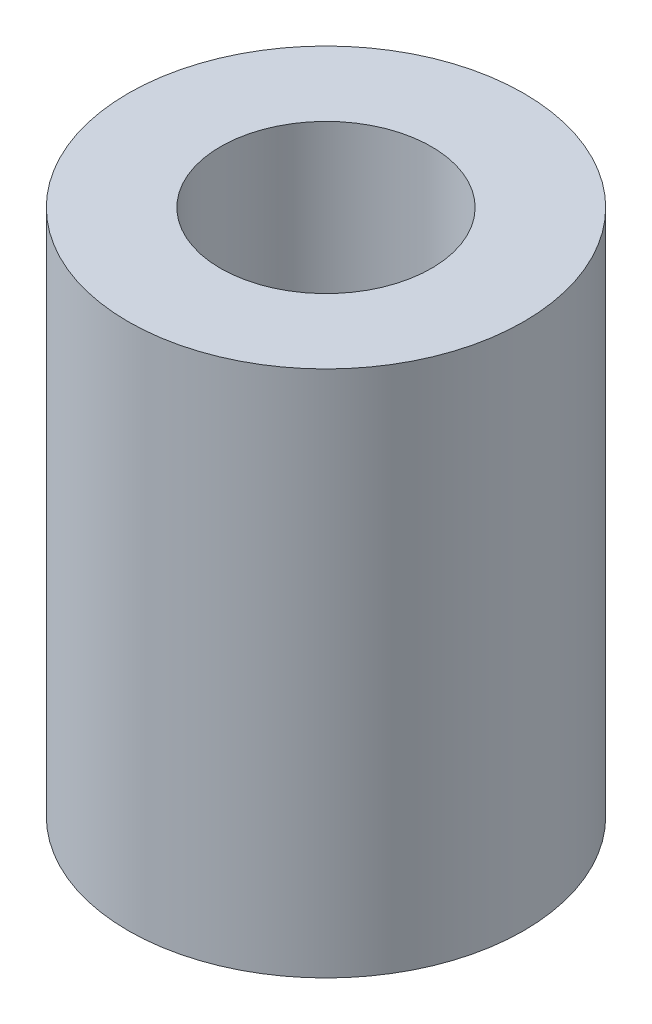
ISO-10303-21;
HEADER;
FILE_DESCRIPTION(('STEP AP214'),'2;1');
FILE_NAME('part.step','',(''),(''),'','','');
FILE_SCHEMA(('AUTOMOTIVE_DESIGN { 1 0 10303 214 1 1 1 1 }'));
ENDSEC;
DATA;
#1=APPLICATION_CONTEXT('core data for automotive mechanical design processes');
#2=APPLICATION_PROTOCOL_DEFINITION('international standard','automotive_design',2000,#1);
#3=PRODUCT_CONTEXT('',#1,'mechanical');
#4=PRODUCT('Part','Part','',(#3));
#5=PRODUCT_RELATED_PRODUCT_CATEGORY('part','',(#4));
#6=PRODUCT_DEFINITION_FORMATION('','',#4);
#7=PRODUCT_DEFINITION_CONTEXT('part definition',#1,'design');
#8=PRODUCT_DEFINITION('design','',#6,#7);
#9=PRODUCT_DEFINITION_SHAPE('','',#8);
#10=(LENGTH_UNIT() NAMED_UNIT(*) SI_UNIT(.MILLI.,.METRE.));
#11=(NAMED_UNIT(*) PLANE_ANGLE_UNIT() SI_UNIT($,.RADIAN.));
#12=(NAMED_UNIT(*) SI_UNIT($,.STERADIAN.) SOLID_ANGLE_UNIT());
#13=UNCERTAINTY_MEASURE_WITH_UNIT(LENGTH_MEASURE(1.E-05),#10,'distance_accuracy_value','');
#14=(GEOMETRIC_REPRESENTATION_CONTEXT(3) GLOBAL_UNCERTAINTY_ASSIGNED_CONTEXT((#13)) GLOBAL_UNIT_ASSIGNED_CONTEXT((#10,
#11,#12)) REPRESENTATION_CONTEXT('',''));
#15=CARTESIAN_POINT('',(0.,0.,0.));
#16=DIRECTION('',(0.,0.,1.));
#17=DIRECTION('',(1.,0.,0.));
#18=AXIS2_PLACEMENT_3D('',#15,#16,#17);
#19=CARTESIAN_POINT('',(0.,8.,0.));
#20=DIRECTION('',(0.,1.,0.));
#21=DIRECTION('',(0.,0.,1.));
#22=AXIS2_PLACEMENT_3D('',#19,#20,#21);
#23=PLANE('',#22);
#24=CARTESIAN_POINT('',(0.,8.,0.));
#25=DIRECTION('',(0.,1.,0.));
#26=DIRECTION('',(0.,0.,1.));
#27=AXIS2_PLACEMENT_3D('',#24,#25,#26);
#28=CIRCLE('',#27,3.);
#29=CARTESIAN_POINT('',(0.,8.,3.));
#30=VERTEX_POINT('',#29);
#31=EDGE_CURVE('E10',#30,#30,#28,.T.);
#32=ORIENTED_EDGE('',*,*,#31,.T.);
#33=EDGE_LOOP('',(#32));
#34=FACE_BOUND('',#33,.T.);
#35=CARTESIAN_POINT('',(0.,8.,0.));
#36=DIRECTION('',(0.,1.,0.));
#37=DIRECTION('',(0.,0.,1.));
#38=AXIS2_PLACEMENT_3D('',#35,#36,#37);
#39=CIRCLE('',#38,1.6);
#40=CARTESIAN_POINT('',(0.,8.,1.6));
#41=VERTEX_POINT('',#40);
#42=EDGE_CURVE('E52',#41,#41,#39,.T.);
#43=ORIENTED_EDGE('',*,*,#42,.F.);
#44=EDGE_LOOP('',(#43));
#45=FACE_BOUND('',#44,.T.);
#46=ADVANCED_FACE('F38',(#34,#45),#23,.T.);
#47=CARTESIAN_POINT('',(0.,0.,0.));
#48=DIRECTION('',(0.,1.,0.));
#49=DIRECTION('',(0.,0.,1.));
#50=AXIS2_PLACEMENT_3D('',#47,#48,#49);
#51=PLANE('',#50);
#52=CARTESIAN_POINT('',(0.,0.,0.));
#53=DIRECTION('',(0.,1.,0.));
#54=DIRECTION('',(0.,0.,1.));
#55=AXIS2_PLACEMENT_3D('',#52,#53,#54);
#56=CIRCLE('',#55,3.);
#57=CARTESIAN_POINT('',(0.,0.,3.));
#58=VERTEX_POINT('',#57);
#59=EDGE_CURVE('E42',#58,#58,#56,.T.);
#60=ORIENTED_EDGE('',*,*,#59,.F.);
#61=EDGE_LOOP('',(#60));
#62=FACE_BOUND('',#61,.T.);
#63=CARTESIAN_POINT('',(0.,0.,0.));
#64=DIRECTION('',(0.,1.,0.));
#65=DIRECTION('',(0.,0.,1.));
#66=AXIS2_PLACEMENT_3D('',#63,#64,#65);
#67=CIRCLE('',#66,1.6);
#68=CARTESIAN_POINT('',(0.,0.,1.6));
#69=VERTEX_POINT('',#68);
#70=EDGE_CURVE('E54',#69,#69,#67,.T.);
#71=ORIENTED_EDGE('',*,*,#70,.T.);
#72=EDGE_LOOP('',(#71));
#73=FACE_BOUND('',#72,.T.);
#74=ADVANCED_FACE('F65',(#62,#73),#51,.F.);
#75=CARTESIAN_POINT('',(0.,8.,0.));
#76=DIRECTION('',(0.,-1.,0.));
#77=DIRECTION('',(0.,0.,-1.));
#78=AXIS2_PLACEMENT_3D('',#75,#76,#77);
#79=CYLINDRICAL_SURFACE('',#78,3.);
#80=ORIENTED_EDGE('',*,*,#31,.F.);
#81=EDGE_LOOP('',(#80));
#82=FACE_BOUND('',#81,.T.);
#83=ORIENTED_EDGE('',*,*,#59,.T.);
#84=EDGE_LOOP('',(#83));
#85=FACE_BOUND('',#84,.T.);
#86=ADVANCED_FACE('F40',(#82,#85),#79,.T.);
#87=CARTESIAN_POINT('',(0.,8.,0.));
#88=DIRECTION('',(0.,-1.,0.));
#89=DIRECTION('',(0.,0.,-1.));
#90=AXIS2_PLACEMENT_3D('',#87,#88,#89);
#91=CYLINDRICAL_SURFACE('',#90,1.6);
#92=ORIENTED_EDGE('',*,*,#42,.T.);
#93=EDGE_LOOP('',(#92));
#94=FACE_BOUND('',#93,.T.);
#95=ORIENTED_EDGE('',*,*,#70,.F.);
#96=EDGE_LOOP('',(#95));
#97=FACE_BOUND('',#96,.T.);
#98=ADVANCED_FACE('F61',(#94,#97),#91,.F.);
#99=CLOSED_SHELL('',(#46,#74,#86,#98));
#100=MANIFOLD_SOLID_BREP('B2',#99);
#101=ADVANCED_BREP_SHAPE_REPRESENTATION('',(#18,#100),#14);
#102=SHAPE_DEFINITION_REPRESENTATION(#9,#101);
ENDSEC;
END-ISO-10303-21;
